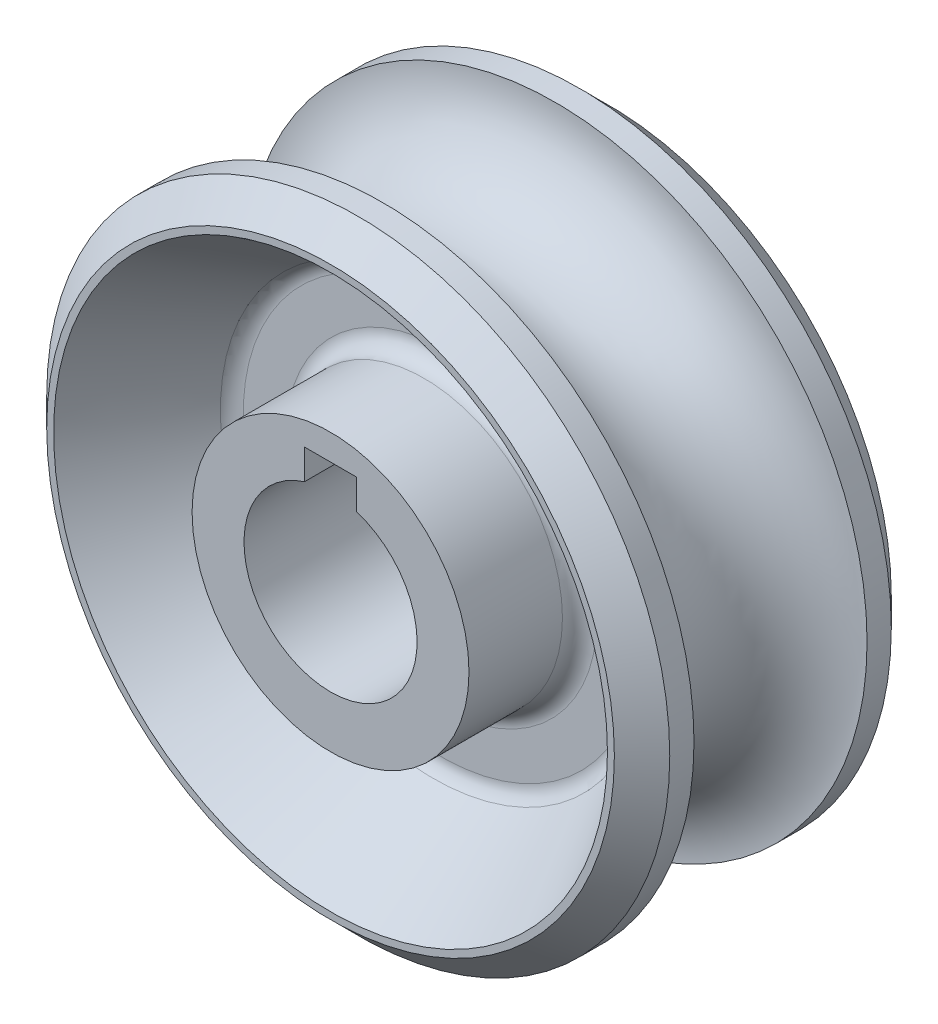
ISO-10303-21;
HEADER;
FILE_DESCRIPTION(('STEP AP214'),'2;1');
FILE_NAME('part.step','',(''),(''),'','','');
FILE_SCHEMA(('AUTOMOTIVE_DESIGN { 1 0 10303 214 1 1 1 1 }'));
ENDSEC;
DATA;
#1=APPLICATION_CONTEXT('core data for automotive mechanical design processes');
#2=APPLICATION_PROTOCOL_DEFINITION('international standard','automotive_design',2000,#1);
#3=PRODUCT_CONTEXT('',#1,'mechanical');
#4=PRODUCT('Part','Part','',(#3));
#5=PRODUCT_RELATED_PRODUCT_CATEGORY('part','',(#4));
#6=PRODUCT_DEFINITION_FORMATION('','',#4);
#7=PRODUCT_DEFINITION_CONTEXT('part definition',#1,'design');
#8=PRODUCT_DEFINITION('design','',#6,#7);
#9=PRODUCT_DEFINITION_SHAPE('','',#8);
#10=(LENGTH_UNIT() NAMED_UNIT(*) SI_UNIT(.MILLI.,.METRE.));
#11=(NAMED_UNIT(*) PLANE_ANGLE_UNIT() SI_UNIT($,.RADIAN.));
#12=(NAMED_UNIT(*) SI_UNIT($,.STERADIAN.) SOLID_ANGLE_UNIT());
#13=UNCERTAINTY_MEASURE_WITH_UNIT(LENGTH_MEASURE(1.E-05),#10,'distance_accuracy_value','');
#14=(GEOMETRIC_REPRESENTATION_CONTEXT(3) GLOBAL_UNCERTAINTY_ASSIGNED_CONTEXT((#13)) GLOBAL_UNIT_ASSIGNED_CONTEXT((#10,
#11,#12)) REPRESENTATION_CONTEXT('',''));
#15=CARTESIAN_POINT('',(0.,0.,0.));
#16=DIRECTION('',(0.,0.,1.));
#17=DIRECTION('',(1.,0.,0.));
#18=AXIS2_PLACEMENT_3D('',#15,#16,#17);
#19=CARTESIAN_POINT('',(0.,0.,12.7));
#20=DIRECTION('',(0.,0.,1.));
#21=DIRECTION('',(1.,0.,0.));
#22=AXIS2_PLACEMENT_3D('',#19,#20,#21);
#23=PLANE('',#22);
#24=CARTESIAN_POINT('',(0.,0.,12.7));
#25=DIRECTION('',(0.,0.,1.));
#26=DIRECTION('',(1.,0.,0.));
#27=AXIS2_PLACEMENT_3D('',#24,#25,#26);
#28=CIRCLE('',#27,26.035);
#29=CARTESIAN_POINT('',(26.035,0.,12.7));
#30=VERTEX_POINT('',#29);
#31=EDGE_CURVE('E132',#30,#30,#28,.T.);
#32=ORIENTED_EDGE('',*,*,#31,.T.);
#33=EDGE_LOOP('',(#32));
#34=FACE_BOUND('',#33,.T.);
#35=CARTESIAN_POINT('',(0.,0.,12.7));
#36=DIRECTION('',(0.,0.,1.));
#37=DIRECTION('',(1.,0.,0.));
#38=AXIS2_PLACEMENT_3D('',#35,#36,#37);
#39=CIRCLE('',#38,25.4);
#40=CARTESIAN_POINT('',(25.4,0.,12.7));
#41=VERTEX_POINT('',#40);
#42=EDGE_CURVE('E108',#41,#41,#39,.T.);
#43=ORIENTED_EDGE('',*,*,#42,.F.);
#44=EDGE_LOOP('',(#43));
#45=FACE_BOUND('',#44,.T.);
#46=ADVANCED_FACE('F33',(#34,#45),#23,.T.);
#47=CARTESIAN_POINT('',(0.,0.,12.7));
#48=DIRECTION('',(0.,0.,-1.));
#49=DIRECTION('',(-1.,0.,0.));
#50=AXIS2_PLACEMENT_3D('',#47,#48,#49);
#51=CYLINDRICAL_SURFACE('',#50,28.575);
#52=CARTESIAN_POINT('',(0.,0.,10.16));
#53=DIRECTION('',(0.,0.,1.));
#54=DIRECTION('',(1.,0.,0.));
#55=AXIS2_PLACEMENT_3D('',#52,#53,#54);
#56=CIRCLE('',#55,28.575);
#57=CARTESIAN_POINT('',(28.575,0.,10.16));
#58=VERTEX_POINT('',#57);
#59=EDGE_CURVE('E135',#58,#58,#56,.F.);
#60=ORIENTED_EDGE('',*,*,#59,.T.);
#61=EDGE_LOOP('',(#60));
#62=FACE_BOUND('',#61,.T.);
#63=CARTESIAN_POINT('',(0.,0.,7.9375));
#64=DIRECTION('',(0.,0.,-1.));
#65=DIRECTION('',(-1.,0.,0.));
#66=AXIS2_PLACEMENT_3D('',#63,#64,#65);
#67=CIRCLE('',#66,28.575);
#68=CARTESIAN_POINT('',(-28.575,0.,7.9375));
#69=VERTEX_POINT('',#68);
#70=EDGE_CURVE('E122',#69,#69,#67,.T.);
#71=ORIENTED_EDGE('',*,*,#70,.F.);
#72=EDGE_LOOP('',(#71));
#73=FACE_BOUND('',#72,.T.);
#74=ADVANCED_FACE('F187',(#62,#73),#51,.T.);
#75=CARTESIAN_POINT('',(0.,0.,-10.16));
#76=DIRECTION('',(0.,0.,1.));
#77=DIRECTION('',(1.,0.,0.));
#78=AXIS2_PLACEMENT_3D('',#75,#76,#77);
#79=CIRCLE('',#78,28.575);
#80=CARTESIAN_POINT('',(28.575,0.,-10.16));
#81=VERTEX_POINT('',#80);
#82=EDGE_CURVE('E118',#81,#81,#79,.T.);
#83=ORIENTED_EDGE('',*,*,#82,.T.);
#84=EDGE_LOOP('',(#83));
#85=FACE_BOUND('',#84,.T.);
#86=CARTESIAN_POINT('',(0.,0.,-7.9375));
#87=DIRECTION('',(0.,0.,1.));
#88=DIRECTION('',(1.,0.,0.));
#89=AXIS2_PLACEMENT_3D('',#86,#87,#88);
#90=CIRCLE('',#89,28.575);
#91=CARTESIAN_POINT('',(28.575,0.,-7.9375));
#92=VERTEX_POINT('',#91);
#93=EDGE_CURVE('E111',#92,#92,#90,.T.);
#94=ORIENTED_EDGE('',*,*,#93,.F.);
#95=EDGE_LOOP('',(#94));
#96=FACE_BOUND('',#95,.T.);
#97=ADVANCED_FACE('F193',(#85,#96),#51,.T.);
#98=CARTESIAN_POINT('',(0.,0.,-12.7));
#99=DIRECTION('',(0.,0.,1.));
#100=DIRECTION('',(1.,0.,0.));
#101=AXIS2_PLACEMENT_3D('',#98,#99,#100);
#102=PLANE('',#101);
#103=CARTESIAN_POINT('',(0.,0.,-12.7));
#104=DIRECTION('',(0.,0.,1.));
#105=DIRECTION('',(1.,0.,0.));
#106=AXIS2_PLACEMENT_3D('',#103,#104,#105);
#107=CIRCLE('',#106,26.035);
#108=CARTESIAN_POINT('',(26.035,0.,-12.7));
#109=VERTEX_POINT('',#108);
#110=EDGE_CURVE('E129',#109,#109,#107,.F.);
#111=ORIENTED_EDGE('',*,*,#110,.T.);
#112=EDGE_LOOP('',(#111));
#113=FACE_BOUND('',#112,.T.);
#114=CARTESIAN_POINT('',(0.,0.,-12.7));
#115=DIRECTION('',(0.,0.,1.));
#116=DIRECTION('',(1.,0.,0.));
#117=AXIS2_PLACEMENT_3D('',#114,#115,#116);
#118=CIRCLE('',#117,25.4);
#119=CARTESIAN_POINT('',(25.4,0.,-12.7));
#120=VERTEX_POINT('',#119);
#121=EDGE_CURVE('E104',#120,#120,#118,.T.);
#122=ORIENTED_EDGE('',*,*,#121,.T.);
#123=EDGE_LOOP('',(#122));
#124=FACE_BOUND('',#123,.T.);
#125=ADVANCED_FACE('F226',(#113,#124),#102,.F.);
#126=CARTESIAN_POINT('',(0.,0.,0.));
#127=DIRECTION('',(0.,0.,1.));
#128=DIRECTION('',(1.,0.,0.));
#129=AXIS2_PLACEMENT_3D('',#126,#127,#128);
#130=TOROIDAL_SURFACE('',#129,28.575,7.9375);
#131=ORIENTED_EDGE('',*,*,#93,.T.);
#132=EDGE_LOOP('',(#131));
#133=FACE_BOUND('',#132,.T.);
#134=ORIENTED_EDGE('',*,*,#70,.T.);
#135=EDGE_LOOP('',(#134));
#136=FACE_BOUND('',#135,.T.);
#137=ADVANCED_FACE('F221',(#133,#136),#130,.F.);
#138=CARTESIAN_POINT('',(0.,0.,0.));
#139=DIRECTION('',(0.,0.,1.));
#140=DIRECTION('',(1.,0.,0.));
#141=AXIS2_PLACEMENT_3D('',#138,#139,#140);
#142=CYLINDRICAL_SURFACE('',#141,12.7);
#143=CARTESIAN_POINT('',(0.,0.,-4.1275));
#144=DIRECTION('',(0.,0.,-1.));
#145=DIRECTION('',(-1.,0.,0.));
#146=AXIS2_PLACEMENT_3D('',#143,#144,#145);
#147=CIRCLE('',#146,12.7);
#148=CARTESIAN_POINT('',(-12.7,0.,-4.1275));
#149=VERTEX_POINT('',#148);
#150=EDGE_CURVE('E147',#149,#149,#147,.T.);
#151=ORIENTED_EDGE('',*,*,#150,.T.);
#152=EDGE_LOOP('',(#151));
#153=FACE_BOUND('',#152,.T.);
#154=CARTESIAN_POINT('',(0.,0.,-12.7));
#155=DIRECTION('',(0.,0.,1.));
#156=DIRECTION('',(1.,0.,0.));
#157=AXIS2_PLACEMENT_3D('',#154,#155,#156);
#158=CIRCLE('',#157,12.7);
#159=CARTESIAN_POINT('',(12.7,0.,-12.7));
#160=VERTEX_POINT('',#159);
#161=EDGE_CURVE('E107',#160,#160,#158,.T.);
#162=ORIENTED_EDGE('',*,*,#161,.T.);
#163=EDGE_LOOP('',(#162));
#164=FACE_BOUND('',#163,.T.);
#165=ADVANCED_FACE('F214',(#153,#164),#142,.T.);
#166=CARTESIAN_POINT('',(0.,12.7,-2.54));
#167=DIRECTION('',(0.,0.,-1.));
#168=DIRECTION('',(-1.,0.,0.));
#169=AXIS2_PLACEMENT_3D('',#166,#167,#168);
#170=PLANE('',#169);
#171=CARTESIAN_POINT('',(0.,0.,-2.54));
#172=DIRECTION('',(0.,0.,-1.));
#173=DIRECTION('',(-1.,0.,0.));
#174=AXIS2_PLACEMENT_3D('',#171,#172,#173);
#175=CIRCLE('',#174,18.1701318691075);
#176=CARTESIAN_POINT('',(-18.1701318691075,0.,-2.54));
#177=VERTEX_POINT('',#176);
#178=EDGE_CURVE('E144',#177,#177,#175,.T.);
#179=ORIENTED_EDGE('',*,*,#178,.T.);
#180=EDGE_LOOP('',(#179));
#181=FACE_BOUND('',#180,.T.);
#182=CARTESIAN_POINT('',(0.,0.,-2.54));
#183=DIRECTION('',(0.,0.,-1.));
#184=DIRECTION('',(-1.,0.,0.));
#185=AXIS2_PLACEMENT_3D('',#182,#183,#184);
#186=CIRCLE('',#185,14.2875);
#187=CARTESIAN_POINT('',(-14.2875,0.,-2.54));
#188=VERTEX_POINT('',#187);
#189=EDGE_CURVE('E141',#188,#188,#186,.F.);
#190=ORIENTED_EDGE('',*,*,#189,.T.);
#191=EDGE_LOOP('',(#190));
#192=FACE_BOUND('',#191,.T.);
#193=ADVANCED_FACE('F208',(#181,#192),#170,.T.);
#194=CARTESIAN_POINT('',(0.,0.,-12.7));
#195=DIRECTION('',(0.,0.,-1.));
#196=DIRECTION('',(-1.,0.,0.));
#197=AXIS2_PLACEMENT_3D('',#194,#195,#196);
#198=CONICAL_SURFACE('',#197,25.4,0.558599315343563);
#199=CARTESIAN_POINT('',(0.,0.,-3.28612668274495));
#200=DIRECTION('',(0.,0.,-1.));
#201=DIRECTION('',(-1.,0.,0.));
#202=AXIS2_PLACEMENT_3D('',#199,#200,#201);
#203=CIRCLE('',#202,19.5163291767156);
#204=CARTESIAN_POINT('',(-19.5163291767156,0.,-3.28612668274495));
#205=VERTEX_POINT('',#204);
#206=EDGE_CURVE('E138',#205,#205,#203,.F.);
#207=ORIENTED_EDGE('',*,*,#206,.T.);
#208=EDGE_LOOP('',(#207));
#209=FACE_BOUND('',#208,.T.);
#210=ORIENTED_EDGE('',*,*,#121,.F.);
#211=EDGE_LOOP('',(#210));
#212=FACE_BOUND('',#211,.T.);
#213=ADVANCED_FACE('F201',(#209,#212),#198,.F.);
#214=DIRECTION('',(0.,-1.,0.));
#215=VECTOR('',#214,1.);
#216=CARTESIAN_POINT('',(-2.3876,0.,12.7));
#217=LINE('',#216,#215);
#218=CARTESIAN_POINT('',(-2.3876,10.3251,12.7));
#219=VERTEX_POINT('',#218);
#220=CARTESIAN_POINT('',(-2.3876,7.56989250187874,12.7));
#221=VERTEX_POINT('',#220);
#222=EDGE_CURVE('E85',#219,#221,#217,.T.);
#223=ORIENTED_EDGE('',*,*,#222,.F.);
#224=DIRECTION('',(-1.,0.,0.));
#225=VECTOR('',#224,1.);
#226=CARTESIAN_POINT('',(2.3876,10.3251,12.7));
#227=LINE('',#226,#225);
#228=CARTESIAN_POINT('',(2.3876,10.3251,12.7));
#229=VERTEX_POINT('',#228);
#230=EDGE_CURVE('E84',#229,#219,#227,.T.);
#231=ORIENTED_EDGE('',*,*,#230,.F.);
#232=DIRECTION('',(0.,1.,0.));
#233=VECTOR('',#232,1.);
#234=CARTESIAN_POINT('',(2.3876,0.,12.7));
#235=LINE('',#234,#233);
#236=CARTESIAN_POINT('',(2.3876,7.56989250187874,12.7));
#237=VERTEX_POINT('',#236);
#238=EDGE_CURVE('E75',#237,#229,#235,.T.);
#239=ORIENTED_EDGE('',*,*,#238,.F.);
#240=CARTESIAN_POINT('',(0.,0.,12.7));
#241=DIRECTION('',(0.,0.,1.));
#242=DIRECTION('',(1.,0.,0.));
#243=AXIS2_PLACEMENT_3D('',#240,#241,#242);
#244=CIRCLE('',#243,7.9375);
#245=EDGE_CURVE('E116',#221,#237,#244,.T.);
#246=ORIENTED_EDGE('',*,*,#245,.F.);
#247=EDGE_LOOP('',(#223,#231,#239,#246));
#248=FACE_BOUND('',#247,.T.);
#249=CARTESIAN_POINT('',(0.,0.,12.7));
#250=DIRECTION('',(0.,0.,1.));
#251=DIRECTION('',(1.,0.,0.));
#252=AXIS2_PLACEMENT_3D('',#249,#250,#251);
#253=CIRCLE('',#252,12.7);
#254=CARTESIAN_POINT('',(12.7,0.,12.7));
#255=VERTEX_POINT('',#254);
#256=EDGE_CURVE('E103',#255,#255,#253,.T.);
#257=ORIENTED_EDGE('',*,*,#256,.T.);
#258=EDGE_LOOP('',(#257));
#259=FACE_BOUND('',#258,.T.);
#260=ADVANCED_FACE('F92',(#248,#259),#23,.T.);
#261=CARTESIAN_POINT('',(0.,0.,12.7));
#262=DIRECTION('',(0.,0.,-1.));
#263=DIRECTION('',(-1.,0.,0.));
#264=AXIS2_PLACEMENT_3D('',#261,#262,#263);
#265=CYLINDRICAL_SURFACE('',#264,7.9375);
#266=DIRECTION('',(0.,0.,-1.));
#267=VECTOR('',#266,1.);
#268=CARTESIAN_POINT('',(-2.3876,7.56989250187874,12.7));
#269=LINE('',#268,#267);
#270=CARTESIAN_POINT('',(-2.3876,7.56989250187874,-12.7));
#271=VERTEX_POINT('',#270);
#272=EDGE_CURVE('E56',#221,#271,#269,.T.);
#273=ORIENTED_EDGE('',*,*,#272,.F.);
#274=ORIENTED_EDGE('',*,*,#245,.T.);
#275=DIRECTION('',(0.,0.,-1.));
#276=VECTOR('',#275,1.);
#277=CARTESIAN_POINT('',(2.3876,7.56989250187874,12.7));
#278=LINE('',#277,#276);
#279=CARTESIAN_POINT('',(2.3876,7.56989250187874,-12.7));
#280=VERTEX_POINT('',#279);
#281=EDGE_CURVE('E79',#280,#237,#278,.F.);
#282=ORIENTED_EDGE('',*,*,#281,.F.);
#283=CARTESIAN_POINT('',(0.,0.,-12.7));
#284=DIRECTION('',(0.,0.,1.));
#285=DIRECTION('',(1.,0.,0.));
#286=AXIS2_PLACEMENT_3D('',#283,#284,#285);
#287=CIRCLE('',#286,7.9375);
#288=EDGE_CURVE('E119',#271,#280,#287,.T.);
#289=ORIENTED_EDGE('',*,*,#288,.F.);
#290=EDGE_LOOP('',(#273,#274,#282,#289));
#291=FACE_BOUND('',#290,.T.);
#292=ADVANCED_FACE('F200',(#291),#265,.F.);
#293=ORIENTED_EDGE('',*,*,#161,.F.);
#294=EDGE_LOOP('',(#293));
#295=FACE_BOUND('',#294,.T.);
#296=DIRECTION('',(-1.,0.,0.));
#297=VECTOR('',#296,1.);
#298=CARTESIAN_POINT('',(2.3876,10.3251,-12.7));
#299=LINE('',#298,#297);
#300=CARTESIAN_POINT('',(2.3876,10.3251,-12.7));
#301=VERTEX_POINT('',#300);
#302=CARTESIAN_POINT('',(-2.3876,10.3251,-12.7));
#303=VERTEX_POINT('',#302);
#304=EDGE_CURVE('E48',#301,#303,#299,.T.);
#305=ORIENTED_EDGE('',*,*,#304,.T.);
#306=DIRECTION('',(0.,-1.,0.));
#307=VECTOR('',#306,1.);
#308=CARTESIAN_POINT('',(-2.3876,0.,-12.7));
#309=LINE('',#308,#307);
#310=EDGE_CURVE('E94',#303,#271,#309,.T.);
#311=ORIENTED_EDGE('',*,*,#310,.T.);
#312=ORIENTED_EDGE('',*,*,#288,.T.);
#313=DIRECTION('',(0.,1.,0.));
#314=VECTOR('',#313,1.);
#315=CARTESIAN_POINT('',(2.3876,0.,-12.7));
#316=LINE('',#315,#314);
#317=EDGE_CURVE('E11',#280,#301,#316,.T.);
#318=ORIENTED_EDGE('',*,*,#317,.T.);
#319=EDGE_LOOP('',(#305,#311,#312,#318));
#320=FACE_BOUND('',#319,.T.);
#321=ADVANCED_FACE('F206',(#295,#320),#102,.F.);
#322=CARTESIAN_POINT('',(0.,0.,2.54));
#323=DIRECTION('',(0.,0.,1.));
#324=DIRECTION('',(1.,0.,0.));
#325=AXIS2_PLACEMENT_3D('',#322,#323,#324);
#326=CONICAL_SURFACE('',#325,19.05,0.558599315343563);
#327=CARTESIAN_POINT('',(0.,0.,3.28612668274495));
#328=DIRECTION('',(0.,0.,1.));
#329=DIRECTION('',(1.,0.,0.));
#330=AXIS2_PLACEMENT_3D('',#327,#328,#329);
#331=CIRCLE('',#330,19.5163291767156);
#332=CARTESIAN_POINT('',(19.5163291767156,0.,3.28612668274495));
#333=VERTEX_POINT('',#332);
#334=EDGE_CURVE('E41',#333,#333,#331,.F.);
#335=ORIENTED_EDGE('',*,*,#334,.T.);
#336=EDGE_LOOP('',(#335));
#337=FACE_BOUND('',#336,.T.);
#338=ORIENTED_EDGE('',*,*,#42,.T.);
#339=EDGE_LOOP('',(#338));
#340=FACE_BOUND('',#339,.T.);
#341=ADVANCED_FACE('F161',(#337,#340),#326,.F.);
#342=CARTESIAN_POINT('',(0.,0.,0.));
#343=DIRECTION('',(0.,0.,1.));
#344=DIRECTION('',(1.,0.,0.));
#345=AXIS2_PLACEMENT_3D('',#342,#343,#344);
#346=CYLINDRICAL_SURFACE('',#345,12.7);
#347=CARTESIAN_POINT('',(0.,0.,4.1275));
#348=DIRECTION('',(0.,0.,1.));
#349=DIRECTION('',(1.,0.,0.));
#350=AXIS2_PLACEMENT_3D('',#347,#348,#349);
#351=CIRCLE('',#350,12.7);
#352=CARTESIAN_POINT('',(12.7,0.,4.1275));
#353=VERTEX_POINT('',#352);
#354=EDGE_CURVE('E150',#353,#353,#351,.T.);
#355=ORIENTED_EDGE('',*,*,#354,.T.);
#356=EDGE_LOOP('',(#355));
#357=FACE_BOUND('',#356,.T.);
#358=ORIENTED_EDGE('',*,*,#256,.F.);
#359=EDGE_LOOP('',(#358));
#360=FACE_BOUND('',#359,.T.);
#361=ADVANCED_FACE('F173',(#357,#360),#346,.T.);
#362=CARTESIAN_POINT('',(0.,12.7,2.54));
#363=DIRECTION('',(0.,0.,1.));
#364=DIRECTION('',(1.,0.,0.));
#365=AXIS2_PLACEMENT_3D('',#362,#363,#364);
#366=PLANE('',#365);
#367=CARTESIAN_POINT('',(0.,0.,2.54));
#368=DIRECTION('',(0.,0.,1.));
#369=DIRECTION('',(1.,0.,0.));
#370=AXIS2_PLACEMENT_3D('',#367,#368,#369);
#371=CIRCLE('',#370,14.2875);
#372=CARTESIAN_POINT('',(14.2875,0.,2.54));
#373=VERTEX_POINT('',#372);
#374=EDGE_CURVE('E156',#373,#373,#371,.F.);
#375=ORIENTED_EDGE('',*,*,#374,.T.);
#376=EDGE_LOOP('',(#375));
#377=FACE_BOUND('',#376,.T.);
#378=CARTESIAN_POINT('',(0.,0.,2.54));
#379=DIRECTION('',(0.,0.,1.));
#380=DIRECTION('',(1.,0.,0.));
#381=AXIS2_PLACEMENT_3D('',#378,#379,#380);
#382=CIRCLE('',#381,18.1701318691075);
#383=CARTESIAN_POINT('',(18.1701318691075,0.,2.54));
#384=VERTEX_POINT('',#383);
#385=EDGE_CURVE('E153',#384,#384,#382,.T.);
#386=ORIENTED_EDGE('',*,*,#385,.T.);
#387=EDGE_LOOP('',(#386));
#388=FACE_BOUND('',#387,.T.);
#389=ADVANCED_FACE('F170',(#377,#388),#366,.T.);
#390=CARTESIAN_POINT('',(0.,0.,-10.16));
#391=DIRECTION('',(0.,0.,1.));
#392=DIRECTION('',(1.,0.,0.));
#393=AXIS2_PLACEMENT_3D('',#390,#391,#392);
#394=CONICAL_SURFACE('',#393,28.575,0.785398163397451);
#395=ORIENTED_EDGE('',*,*,#110,.F.);
#396=EDGE_LOOP('',(#395));
#397=FACE_BOUND('',#396,.T.);
#398=ORIENTED_EDGE('',*,*,#82,.F.);
#399=EDGE_LOOP('',(#398));
#400=FACE_BOUND('',#399,.T.);
#401=ADVANCED_FACE('F172',(#397,#400),#394,.T.);
#402=CARTESIAN_POINT('',(0.,0.,12.7));
#403=DIRECTION('',(0.,0.,-1.));
#404=DIRECTION('',(-1.,0.,0.));
#405=AXIS2_PLACEMENT_3D('',#402,#403,#404);
#406=CONICAL_SURFACE('',#405,26.035,0.785398163397446);
#407=ORIENTED_EDGE('',*,*,#59,.F.);
#408=EDGE_LOOP('',(#407));
#409=FACE_BOUND('',#408,.T.);
#410=ORIENTED_EDGE('',*,*,#31,.F.);
#411=EDGE_LOOP('',(#410));
#412=FACE_BOUND('',#411,.T.);
#413=ADVANCED_FACE('F180',(#409,#412),#406,.T.);
#414=CARTESIAN_POINT('',(0.,0.,-4.1275));
#415=DIRECTION('',(0.,0.,-1.));
#416=DIRECTION('',(-1.,0.,0.));
#417=AXIS2_PLACEMENT_3D('',#414,#415,#416);
#418=TOROIDAL_SURFACE('',#417,18.1701318691075,1.5875);
#419=ORIENTED_EDGE('',*,*,#178,.F.);
#420=EDGE_LOOP('',(#419));
#421=FACE_BOUND('',#420,.T.);
#422=ORIENTED_EDGE('',*,*,#206,.F.);
#423=EDGE_LOOP('',(#422));
#424=FACE_BOUND('',#423,.T.);
#425=ADVANCED_FACE('F299',(#421,#424),#418,.F.);
#426=CARTESIAN_POINT('',(0.,0.,-4.1275));
#427=DIRECTION('',(0.,0.,-1.));
#428=DIRECTION('',(-1.,0.,0.));
#429=AXIS2_PLACEMENT_3D('',#426,#427,#428);
#430=TOROIDAL_SURFACE('',#429,14.2875,1.5875);
#431=ORIENTED_EDGE('',*,*,#150,.F.);
#432=EDGE_LOOP('',(#431));
#433=FACE_BOUND('',#432,.T.);
#434=ORIENTED_EDGE('',*,*,#189,.F.);
#435=EDGE_LOOP('',(#434));
#436=FACE_BOUND('',#435,.T.);
#437=ADVANCED_FACE('F290',(#433,#436),#430,.F.);
#438=CARTESIAN_POINT('',(0.,0.,4.1275));
#439=DIRECTION('',(0.,0.,1.));
#440=DIRECTION('',(1.,0.,0.));
#441=AXIS2_PLACEMENT_3D('',#438,#439,#440);
#442=TOROIDAL_SURFACE('',#441,14.2875,1.5875);
#443=ORIENTED_EDGE('',*,*,#374,.F.);
#444=EDGE_LOOP('',(#443));
#445=FACE_BOUND('',#444,.T.);
#446=ORIENTED_EDGE('',*,*,#354,.F.);
#447=EDGE_LOOP('',(#446));
#448=FACE_BOUND('',#447,.T.);
#449=ADVANCED_FACE('F167',(#445,#448),#442,.F.);
#450=CARTESIAN_POINT('',(0.,0.,4.1275));
#451=DIRECTION('',(0.,0.,1.));
#452=DIRECTION('',(1.,0.,0.));
#453=AXIS2_PLACEMENT_3D('',#450,#451,#452);
#454=TOROIDAL_SURFACE('',#453,18.1701318691075,1.5875);
#455=ORIENTED_EDGE('',*,*,#334,.F.);
#456=EDGE_LOOP('',(#455));
#457=FACE_BOUND('',#456,.T.);
#458=ORIENTED_EDGE('',*,*,#385,.F.);
#459=EDGE_LOOP('',(#458));
#460=FACE_BOUND('',#459,.T.);
#461=ADVANCED_FACE('F35',(#457,#460),#454,.F.);
#462=CARTESIAN_POINT('',(-2.3876,0.,-12.7));
#463=DIRECTION('',(-1.,0.,0.));
#464=DIRECTION('',(0.,0.,1.));
#465=AXIS2_PLACEMENT_3D('',#462,#463,#464);
#466=PLANE('',#465);
#467=ORIENTED_EDGE('',*,*,#272,.T.);
#468=ORIENTED_EDGE('',*,*,#310,.F.);
#469=DIRECTION('',(0.,0.,1.));
#470=VECTOR('',#469,1.);
#471=CARTESIAN_POINT('',(-2.3876,10.3251,-12.7));
#472=LINE('',#471,#470);
#473=EDGE_CURVE('E90',#303,#219,#472,.T.);
#474=ORIENTED_EDGE('',*,*,#473,.T.);
#475=ORIENTED_EDGE('',*,*,#222,.T.);
#476=EDGE_LOOP('',(#467,#468,#474,#475));
#477=FACE_BOUND('',#476,.T.);
#478=ADVANCED_FACE('F166',(#477),#466,.F.);
#479=CARTESIAN_POINT('',(2.3876,10.3251,-12.7));
#480=DIRECTION('',(0.,1.,0.));
#481=DIRECTION('',(0.,0.,1.));
#482=AXIS2_PLACEMENT_3D('',#479,#480,#481);
#483=PLANE('',#482);
#484=ORIENTED_EDGE('',*,*,#473,.F.);
#485=ORIENTED_EDGE('',*,*,#304,.F.);
#486=DIRECTION('',(0.,0.,1.));
#487=VECTOR('',#486,1.);
#488=CARTESIAN_POINT('',(2.3876,10.3251,-12.7));
#489=LINE('',#488,#487);
#490=EDGE_CURVE('E77',#301,#229,#489,.T.);
#491=ORIENTED_EDGE('',*,*,#490,.T.);
#492=ORIENTED_EDGE('',*,*,#230,.T.);
#493=EDGE_LOOP('',(#484,#485,#491,#492));
#494=FACE_BOUND('',#493,.T.);
#495=ADVANCED_FACE('F88',(#494),#483,.F.);
#496=CARTESIAN_POINT('',(2.3876,0.,-12.7));
#497=DIRECTION('',(1.,0.,0.));
#498=DIRECTION('',(0.,0.,-1.));
#499=AXIS2_PLACEMENT_3D('',#496,#497,#498);
#500=PLANE('',#499);
#501=ORIENTED_EDGE('',*,*,#281,.T.);
#502=ORIENTED_EDGE('',*,*,#238,.T.);
#503=ORIENTED_EDGE('',*,*,#490,.F.);
#504=ORIENTED_EDGE('',*,*,#317,.F.);
#505=EDGE_LOOP('',(#501,#502,#503,#504));
#506=FACE_BOUND('',#505,.T.);
#507=ADVANCED_FACE('F76',(#506),#500,.F.);
#508=CLOSED_SHELL('',(#46,#74,#97,#125,#137,#165,#193,#213,#260,#292,#321,#341,#361,#389,#401,
#413,#425,#437,#449,#461,#478,#495,#507));
#509=MANIFOLD_SOLID_BREP('B2',#508);
#510=ADVANCED_BREP_SHAPE_REPRESENTATION('',(#18,#509),#14);
#511=SHAPE_DEFINITION_REPRESENTATION(#9,#510);
ENDSEC;
END-ISO-10303-21;
